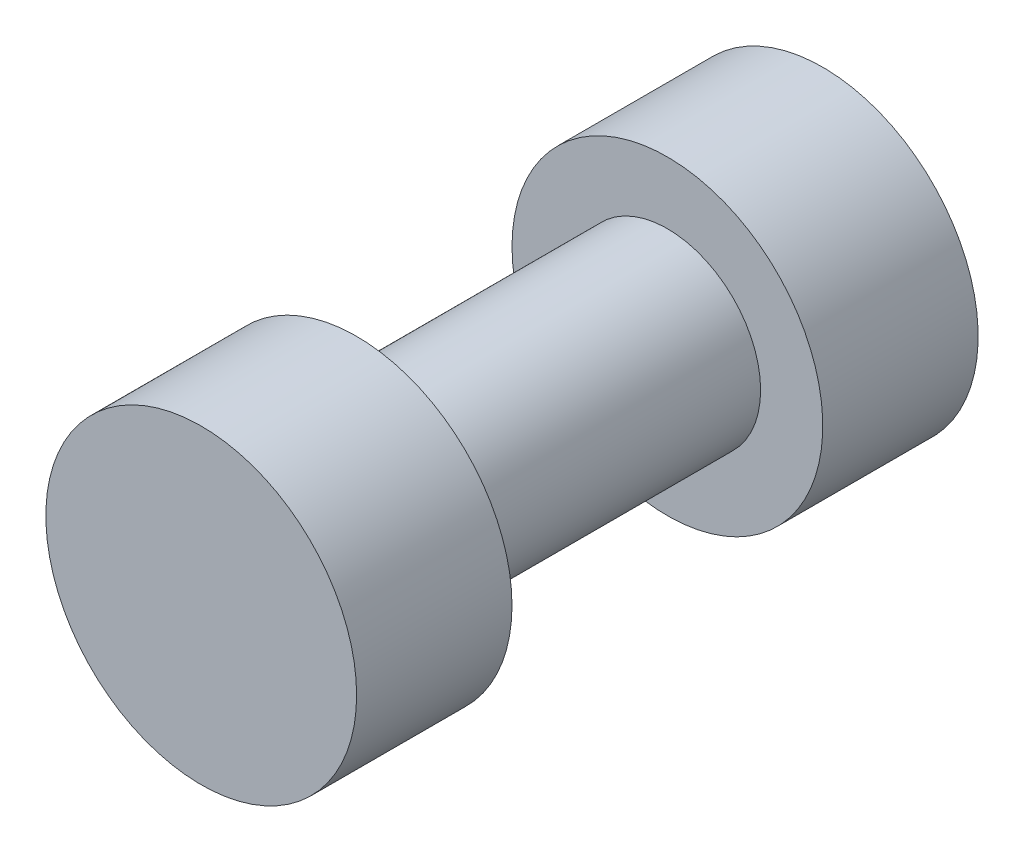
ISO-10303-21;
HEADER;
FILE_DESCRIPTION(('STEP AP214'),'2;1');
FILE_NAME('part.step','',(''),(''),'','','');
FILE_SCHEMA(('AUTOMOTIVE_DESIGN { 1 0 10303 214 1 1 1 1 }'));
ENDSEC;
DATA;
#1=APPLICATION_CONTEXT('core data for automotive mechanical design processes');
#2=APPLICATION_PROTOCOL_DEFINITION('international standard','automotive_design',2000,#1);
#3=PRODUCT_CONTEXT('',#1,'mechanical');
#4=PRODUCT('Part','Part','',(#3));
#5=PRODUCT_RELATED_PRODUCT_CATEGORY('part','',(#4));
#6=PRODUCT_DEFINITION_FORMATION('','',#4);
#7=PRODUCT_DEFINITION_CONTEXT('part definition',#1,'design');
#8=PRODUCT_DEFINITION('design','',#6,#7);
#9=PRODUCT_DEFINITION_SHAPE('','',#8);
#10=(LENGTH_UNIT() NAMED_UNIT(*) SI_UNIT(.MILLI.,.METRE.));
#11=(NAMED_UNIT(*) PLANE_ANGLE_UNIT() SI_UNIT($,.RADIAN.));
#12=(NAMED_UNIT(*) SI_UNIT($,.STERADIAN.) SOLID_ANGLE_UNIT());
#13=UNCERTAINTY_MEASURE_WITH_UNIT(LENGTH_MEASURE(1.E-05),#10,'distance_accuracy_value','');
#14=(GEOMETRIC_REPRESENTATION_CONTEXT(3) GLOBAL_UNCERTAINTY_ASSIGNED_CONTEXT((#13)) GLOBAL_UNIT_ASSIGNED_CONTEXT((#10,
#11,#12)) REPRESENTATION_CONTEXT('',''));
#15=CARTESIAN_POINT('',(0.,0.,0.));
#16=DIRECTION('',(0.,0.,1.));
#17=DIRECTION('',(1.,0.,0.));
#18=AXIS2_PLACEMENT_3D('',#15,#16,#17);
#19=CARTESIAN_POINT('',(0.,0.,9.99999999999999));
#20=DIRECTION('',(0.,0.,-1.));
#21=DIRECTION('',(-1.00000000000001,0.,0.));
#22=AXIS2_PLACEMENT_3D('',#19,#20,#21);
#23=CYLINDRICAL_SURFACE('',#22,3.);
#24=CARTESIAN_POINT('',(0.,0.,9.99999999999999));
#25=DIRECTION('',(0.,0.,1.));
#26=DIRECTION('',(1.00000000000001,0.,0.));
#27=AXIS2_PLACEMENT_3D('',#24,#25,#26);
#28=CIRCLE('',#27,3.);
#29=CARTESIAN_POINT('',(3.00000000000003,0.,9.99999999999999));
#30=VERTEX_POINT('',#29);
#31=EDGE_CURVE('E12',#30,#30,#28,.T.);
#32=ORIENTED_EDGE('',*,*,#31,.F.);
#33=EDGE_LOOP('',(#32));
#34=FACE_BOUND('',#33,.T.);
#35=CARTESIAN_POINT('',(0.,0.,0.));
#36=DIRECTION('',(0.,0.,1.));
#37=DIRECTION('',(1.00000000000001,0.,0.));
#38=AXIS2_PLACEMENT_3D('',#35,#36,#37);
#39=CIRCLE('',#38,3.);
#40=CARTESIAN_POINT('',(3.00000000000003,0.,0.));
#41=VERTEX_POINT('',#40);
#42=EDGE_CURVE('E51',#41,#41,#39,.T.);
#43=ORIENTED_EDGE('',*,*,#42,.T.);
#44=EDGE_LOOP('',(#43));
#45=FACE_BOUND('',#44,.T.);
#46=ADVANCED_FACE('F48',(#34,#45),#23,.T.);
#47=CARTESIAN_POINT('',(0.,0.,15.));
#48=DIRECTION('',(0.,0.,-1.));
#49=DIRECTION('',(-1.00000000000001,0.,0.));
#50=AXIS2_PLACEMENT_3D('',#47,#48,#49);
#51=CYLINDRICAL_SURFACE('',#50,5.);
#52=CARTESIAN_POINT('',(0.,0.,15.));
#53=DIRECTION('',(0.,0.,1.));
#54=DIRECTION('',(1.00000000000001,0.,0.));
#55=AXIS2_PLACEMENT_3D('',#52,#53,#54);
#56=CIRCLE('',#55,5.);
#57=CARTESIAN_POINT('',(5.00000000000005,0.,15.));
#58=VERTEX_POINT('',#57);
#59=EDGE_CURVE('E55',#58,#58,#56,.T.);
#60=ORIENTED_EDGE('',*,*,#59,.F.);
#61=EDGE_LOOP('',(#60));
#62=FACE_BOUND('',#61,.T.);
#63=CARTESIAN_POINT('',(0.,0.,9.99999999999999));
#64=DIRECTION('',(0.,0.,1.));
#65=DIRECTION('',(1.00000000000001,0.,0.));
#66=AXIS2_PLACEMENT_3D('',#63,#64,#65);
#67=CIRCLE('',#66,5.);
#68=CARTESIAN_POINT('',(5.00000000000005,0.,9.99999999999999));
#69=VERTEX_POINT('',#68);
#70=EDGE_CURVE('E59',#69,#69,#67,.T.);
#71=ORIENTED_EDGE('',*,*,#70,.T.);
#72=EDGE_LOOP('',(#71));
#73=FACE_BOUND('',#72,.T.);
#74=ADVANCED_FACE('F96',(#62,#73),#51,.T.);
#75=CARTESIAN_POINT('',(0.,0.,15.));
#76=DIRECTION('',(0.,0.,1.));
#77=DIRECTION('',(1.00000000000001,0.,0.));
#78=AXIS2_PLACEMENT_3D('',#75,#76,#77);
#79=PLANE('',#78);
#80=ORIENTED_EDGE('',*,*,#59,.T.);
#81=EDGE_LOOP('',(#80));
#82=FACE_BOUND('',#81,.T.);
#83=ADVANCED_FACE('F92',(#82),#79,.T.);
#84=CARTESIAN_POINT('',(0.,0.,9.99999999999999));
#85=DIRECTION('',(0.,0.,1.));
#86=DIRECTION('',(1.00000000000001,0.,0.));
#87=AXIS2_PLACEMENT_3D('',#84,#85,#86);
#88=PLANE('',#87);
#89=ORIENTED_EDGE('',*,*,#31,.T.);
#90=EDGE_LOOP('',(#89));
#91=FACE_BOUND('',#90,.T.);
#92=ORIENTED_EDGE('',*,*,#70,.F.);
#93=EDGE_LOOP('',(#92));
#94=FACE_BOUND('',#93,.T.);
#95=ADVANCED_FACE('F84',(#91,#94),#88,.F.);
#96=CARTESIAN_POINT('',(0.,0.,-5.));
#97=DIRECTION('',(0.,0.,1.));
#98=DIRECTION('',(1.00000000000001,0.,0.));
#99=AXIS2_PLACEMENT_3D('',#96,#97,#98);
#100=CYLINDRICAL_SURFACE('',#99,5.);
#101=CARTESIAN_POINT('',(0.,0.,-5.));
#102=DIRECTION('',(0.,0.,-1.));
#103=DIRECTION('',(-1.00000000000001,0.,0.));
#104=AXIS2_PLACEMENT_3D('',#101,#102,#103);
#105=CIRCLE('',#104,5.);
#106=CARTESIAN_POINT('',(-5.00000000000005,0.,-5.));
#107=VERTEX_POINT('',#106);
#108=EDGE_CURVE('E67',#107,#107,#105,.T.);
#109=ORIENTED_EDGE('',*,*,#108,.F.);
#110=EDGE_LOOP('',(#109));
#111=FACE_BOUND('',#110,.T.);
#112=CARTESIAN_POINT('',(0.,0.,0.));
#113=DIRECTION('',(0.,0.,-1.));
#114=DIRECTION('',(-1.00000000000001,0.,0.));
#115=AXIS2_PLACEMENT_3D('',#112,#113,#114);
#116=CIRCLE('',#115,5.);
#117=CARTESIAN_POINT('',(-5.00000000000005,0.,0.));
#118=VERTEX_POINT('',#117);
#119=EDGE_CURVE('E64',#118,#118,#116,.T.);
#120=ORIENTED_EDGE('',*,*,#119,.T.);
#121=EDGE_LOOP('',(#120));
#122=FACE_BOUND('',#121,.T.);
#123=ADVANCED_FACE('F82',(#111,#122),#100,.T.);
#124=CARTESIAN_POINT('',(0.,0.,-5.));
#125=DIRECTION('',(0.,0.,-1.));
#126=DIRECTION('',(-1.00000000000001,0.,0.));
#127=AXIS2_PLACEMENT_3D('',#124,#125,#126);
#128=PLANE('',#127);
#129=ORIENTED_EDGE('',*,*,#108,.T.);
#130=EDGE_LOOP('',(#129));
#131=FACE_BOUND('',#130,.T.);
#132=ADVANCED_FACE('F78',(#131),#128,.T.);
#133=CARTESIAN_POINT('',(0.,0.,0.));
#134=DIRECTION('',(0.,0.,-1.));
#135=DIRECTION('',(-1.00000000000001,0.,0.));
#136=AXIS2_PLACEMENT_3D('',#133,#134,#135);
#137=PLANE('',#136);
#138=ORIENTED_EDGE('',*,*,#42,.F.);
#139=EDGE_LOOP('',(#138));
#140=FACE_BOUND('',#139,.T.);
#141=ORIENTED_EDGE('',*,*,#119,.F.);
#142=EDGE_LOOP('',(#141));
#143=FACE_BOUND('',#142,.T.);
#144=ADVANCED_FACE('F75',(#140,#143),#137,.F.);
#145=CLOSED_SHELL('',(#46,#74,#83,#95,#123,#132,#144));
#146=MANIFOLD_SOLID_BREP('B2',#145);
#147=ADVANCED_BREP_SHAPE_REPRESENTATION('',(#18,#146),#14);
#148=SHAPE_DEFINITION_REPRESENTATION(#9,#147);
ENDSEC;
END-ISO-10303-21;
